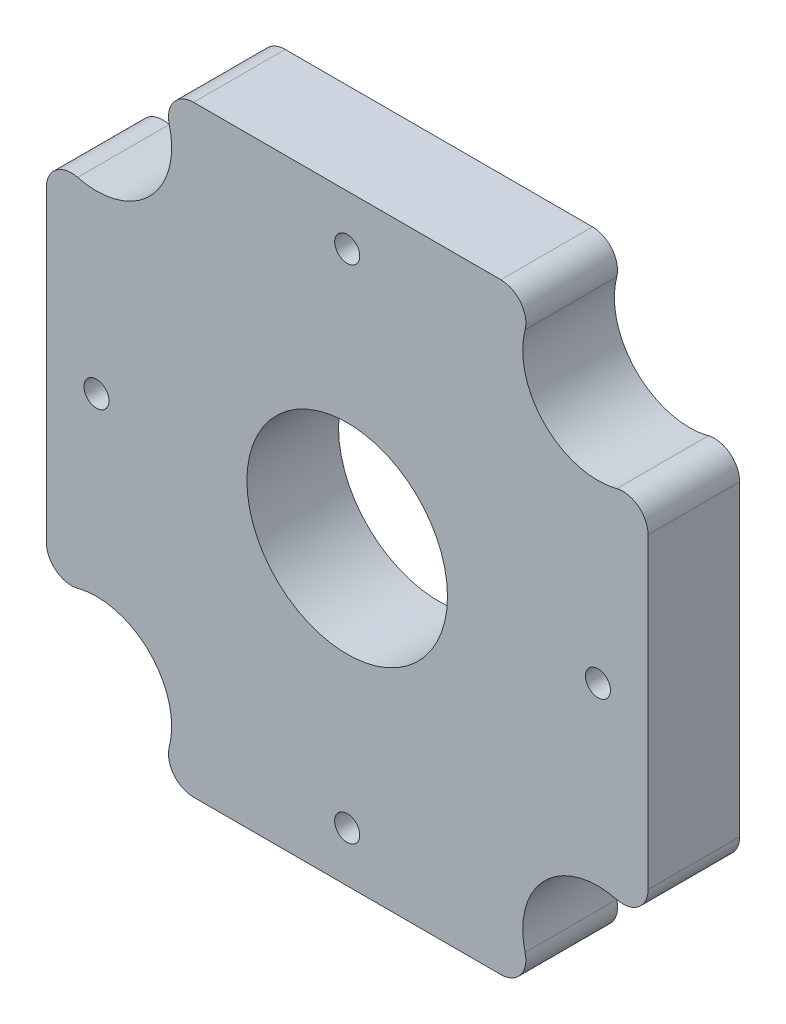
ISO-10303-21;
HEADER;
FILE_DESCRIPTION(('STEP AP214'),'2;1');
FILE_NAME('part.step','',(''),(''),'','','');
FILE_SCHEMA(('AUTOMOTIVE_DESIGN { 1 0 10303 214 1 1 1 1 }'));
ENDSEC;
DATA;
#1=APPLICATION_CONTEXT('core data for automotive mechanical design processes');
#2=APPLICATION_PROTOCOL_DEFINITION('international standard','automotive_design',2000,#1);
#3=PRODUCT_CONTEXT('',#1,'mechanical');
#4=PRODUCT('Part','Part','',(#3));
#5=PRODUCT_RELATED_PRODUCT_CATEGORY('part','',(#4));
#6=PRODUCT_DEFINITION_FORMATION('','',#4);
#7=PRODUCT_DEFINITION_CONTEXT('part definition',#1,'design');
#8=PRODUCT_DEFINITION('design','',#6,#7);
#9=PRODUCT_DEFINITION_SHAPE('','',#8);
#10=(LENGTH_UNIT() NAMED_UNIT(*) SI_UNIT(.MILLI.,.METRE.));
#11=(NAMED_UNIT(*) PLANE_ANGLE_UNIT() SI_UNIT($,.RADIAN.));
#12=(NAMED_UNIT(*) SI_UNIT($,.STERADIAN.) SOLID_ANGLE_UNIT());
#13=UNCERTAINTY_MEASURE_WITH_UNIT(LENGTH_MEASURE(1.E-05),#10,'distance_accuracy_value','');
#14=(GEOMETRIC_REPRESENTATION_CONTEXT(3) GLOBAL_UNCERTAINTY_ASSIGNED_CONTEXT((#13)) GLOBAL_UNIT_ASSIGNED_CONTEXT((#10,
#11,#12)) REPRESENTATION_CONTEXT('',''));
#15=CARTESIAN_POINT('',(0.,0.,0.));
#16=DIRECTION('',(0.,0.,1.));
#17=DIRECTION('',(1.,0.,0.));
#18=AXIS2_PLACEMENT_3D('',#15,#16,#17);
#19=CARTESIAN_POINT('',(-15.875,15.875,5.8));
#20=DIRECTION('',(0.,0.,-1.));
#21=DIRECTION('',(-1.,0.,0.));
#22=AXIS2_PLACEMENT_3D('',#19,#20,#21);
#23=CYLINDRICAL_SURFACE('',#22,4.7625);
#24=CARTESIAN_POINT('',(-15.875,15.875,5.8));
#25=DIRECTION('',(0.,0.,-1.));
#26=DIRECTION('',(-1.,0.,0.));
#27=AXIS2_PLACEMENT_3D('',#24,#25,#26);
#28=CIRCLE('',#27,4.7625);
#29=CARTESIAN_POINT('',(-11.2637292034218,17.065625,5.8));
#30=VERTEX_POINT('',#29);
#31=CARTESIAN_POINT('',(-17.065625,11.2637292034218,5.8));
#32=VERTEX_POINT('',#31);
#33=EDGE_CURVE('E185',#30,#32,#28,.T.);
#34=ORIENTED_EDGE('',*,*,#33,.F.);
#35=DIRECTION('',(0.,0.,-1.));
#36=VECTOR('',#35,1.);
#37=CARTESIAN_POINT('',(-11.2637292034218,17.065625,5.8));
#38=LINE('',#37,#36);
#39=CARTESIAN_POINT('',(-11.2637292034218,17.065625,0.));
#40=VERTEX_POINT('',#39);
#41=EDGE_CURVE('E11',#30,#40,#38,.T.);
#42=ORIENTED_EDGE('',*,*,#41,.T.);
#43=CARTESIAN_POINT('',(-15.875,15.875,0.));
#44=DIRECTION('',(0.,0.,-1.));
#45=DIRECTION('',(-1.,0.,0.));
#46=AXIS2_PLACEMENT_3D('',#43,#44,#45);
#47=CIRCLE('',#46,4.7625);
#48=CARTESIAN_POINT('',(-17.065625,11.2637292034218,0.));
#49=VERTEX_POINT('',#48);
#50=EDGE_CURVE('E252',#40,#49,#47,.T.);
#51=ORIENTED_EDGE('',*,*,#50,.T.);
#52=DIRECTION('',(0.,0.,-1.));
#53=VECTOR('',#52,1.);
#54=CARTESIAN_POINT('',(-17.065625,11.2637292034218,5.8));
#55=LINE('',#54,#53);
#56=EDGE_CURVE('E40',#49,#32,#55,.F.);
#57=ORIENTED_EDGE('',*,*,#56,.T.);
#58=EDGE_LOOP('',(#34,#42,#51,#57));
#59=FACE_BOUND('',#58,.T.);
#60=ADVANCED_FACE('F32',(#59),#23,.F.);
#61=CARTESIAN_POINT('',(-19.05,12.3252420857191,5.8));
#62=DIRECTION('',(1.,0.,0.));
#63=DIRECTION('',(0.,0.,-1.));
#64=AXIS2_PLACEMENT_3D('',#61,#62,#63);
#65=PLANE('',#64);
#66=DIRECTION('',(0.,-1.,0.));
#67=VECTOR('',#66,1.);
#68=CARTESIAN_POINT('',(-19.05,12.3252420857191,0.));
#69=LINE('',#68,#67);
#70=CARTESIAN_POINT('',(-19.05,9.72663893789572,0.));
#71=VERTEX_POINT('',#70);
#72=CARTESIAN_POINT('',(-19.05,-9.72663893789572,0.));
#73=VERTEX_POINT('',#72);
#74=EDGE_CURVE('E267',#71,#73,#69,.T.);
#75=ORIENTED_EDGE('',*,*,#74,.T.);
#76=DIRECTION('',(0.,0.,-1.));
#77=VECTOR('',#76,1.);
#78=CARTESIAN_POINT('',(-19.05,-9.72663893789572,5.8));
#79=LINE('',#78,#77);
#80=CARTESIAN_POINT('',(-19.05,-9.72663893789572,5.8));
#81=VERTEX_POINT('',#80);
#82=EDGE_CURVE('E230',#73,#81,#79,.F.);
#83=ORIENTED_EDGE('',*,*,#82,.T.);
#84=DIRECTION('',(0.,-1.,0.));
#85=VECTOR('',#84,1.);
#86=CARTESIAN_POINT('',(-19.05,12.3252420857191,5.8));
#87=LINE('',#86,#85);
#88=CARTESIAN_POINT('',(-19.05,9.72663893789572,5.8));
#89=VERTEX_POINT('',#88);
#90=EDGE_CURVE('E260',#89,#81,#87,.T.);
#91=ORIENTED_EDGE('',*,*,#90,.F.);
#92=DIRECTION('',(0.,0.,-1.));
#93=VECTOR('',#92,1.);
#94=CARTESIAN_POINT('',(-19.05,9.72663893789572,5.8));
#95=LINE('',#94,#93);
#96=EDGE_CURVE('E227',#89,#71,#95,.T.);
#97=ORIENTED_EDGE('',*,*,#96,.T.);
#98=EDGE_LOOP('',(#75,#83,#91,#97));
#99=FACE_BOUND('',#98,.T.);
#100=ADVANCED_FACE('F266',(#99),#65,.F.);
#101=CARTESIAN_POINT('',(-15.875,-15.875,5.8));
#102=DIRECTION('',(0.,0.,-1.));
#103=DIRECTION('',(-1.,0.,0.));
#104=AXIS2_PLACEMENT_3D('',#101,#102,#103);
#105=CYLINDRICAL_SURFACE('',#104,4.7625);
#106=CARTESIAN_POINT('',(-15.875,-15.875,5.8));
#107=DIRECTION('',(0.,0.,-1.));
#108=DIRECTION('',(1.,0.,0.));
#109=AXIS2_PLACEMENT_3D('',#106,#107,#108);
#110=CIRCLE('',#109,4.7625);
#111=CARTESIAN_POINT('',(-17.065625,-11.2637292034218,5.8));
#112=VERTEX_POINT('',#111);
#113=CARTESIAN_POINT('',(-11.2637292034218,-17.065625,5.8));
#114=VERTEX_POINT('',#113);
#115=EDGE_CURVE('E297',#112,#114,#110,.T.);
#116=ORIENTED_EDGE('',*,*,#115,.F.);
#117=DIRECTION('',(0.,0.,-1.));
#118=VECTOR('',#117,1.);
#119=CARTESIAN_POINT('',(-17.065625,-11.2637292034218,5.8));
#120=LINE('',#119,#118);
#121=CARTESIAN_POINT('',(-17.065625,-11.2637292034218,0.));
#122=VERTEX_POINT('',#121);
#123=EDGE_CURVE('E224',#112,#122,#120,.T.);
#124=ORIENTED_EDGE('',*,*,#123,.T.);
#125=CARTESIAN_POINT('',(-15.875,-15.875,0.));
#126=DIRECTION('',(0.,0.,-1.));
#127=DIRECTION('',(1.,0.,0.));
#128=AXIS2_PLACEMENT_3D('',#125,#126,#127);
#129=CIRCLE('',#128,4.7625);
#130=CARTESIAN_POINT('',(-11.2637292034218,-17.065625,0.));
#131=VERTEX_POINT('',#130);
#132=EDGE_CURVE('E270',#122,#131,#129,.T.);
#133=ORIENTED_EDGE('',*,*,#132,.T.);
#134=DIRECTION('',(0.,0.,-1.));
#135=VECTOR('',#134,1.);
#136=CARTESIAN_POINT('',(-11.2637292034218,-17.065625,5.8));
#137=LINE('',#136,#135);
#138=EDGE_CURVE('E222',#131,#114,#137,.F.);
#139=ORIENTED_EDGE('',*,*,#138,.T.);
#140=EDGE_LOOP('',(#116,#124,#133,#139));
#141=FACE_BOUND('',#140,.T.);
#142=ADVANCED_FACE('F330',(#141),#105,.F.);
#143=CARTESIAN_POINT('',(12.3252420857191,-19.05,5.8));
#144=DIRECTION('',(0.,1.,0.));
#145=DIRECTION('',(0.,0.,1.));
#146=AXIS2_PLACEMENT_3D('',#143,#144,#145);
#147=PLANE('',#146);
#148=DIRECTION('',(1.,0.,0.));
#149=VECTOR('',#148,1.);
#150=CARTESIAN_POINT('',(12.3252420857191,-19.05,5.8));
#151=LINE('',#150,#149);
#152=CARTESIAN_POINT('',(-9.72663893789572,-19.05,5.8));
#153=VERTEX_POINT('',#152);
#154=CARTESIAN_POINT('',(9.7266389378957,-19.05,5.8));
#155=VERTEX_POINT('',#154);
#156=EDGE_CURVE('E291',#153,#155,#151,.T.);
#157=ORIENTED_EDGE('',*,*,#156,.F.);
#158=DIRECTION('',(0.,0.,-1.));
#159=VECTOR('',#158,1.);
#160=CARTESIAN_POINT('',(-9.72663893789572,-19.05,5.8));
#161=LINE('',#160,#159);
#162=CARTESIAN_POINT('',(-9.72663893789572,-19.05,0.));
#163=VERTEX_POINT('',#162);
#164=EDGE_CURVE('E234',#153,#163,#161,.T.);
#165=ORIENTED_EDGE('',*,*,#164,.T.);
#166=DIRECTION('',(1.,0.,0.));
#167=VECTOR('',#166,1.);
#168=CARTESIAN_POINT('',(12.3252420857191,-19.05,0.));
#169=LINE('',#168,#167);
#170=CARTESIAN_POINT('',(9.7266389378957,-19.05,0.));
#171=VERTEX_POINT('',#170);
#172=EDGE_CURVE('E180',#163,#171,#169,.T.);
#173=ORIENTED_EDGE('',*,*,#172,.T.);
#174=DIRECTION('',(0.,0.,-1.));
#175=VECTOR('',#174,1.);
#176=CARTESIAN_POINT('',(9.7266389378957,-19.05,5.8));
#177=LINE('',#176,#175);
#178=EDGE_CURVE('E232',#171,#155,#177,.F.);
#179=ORIENTED_EDGE('',*,*,#178,.T.);
#180=EDGE_LOOP('',(#157,#165,#173,#179));
#181=FACE_BOUND('',#180,.T.);
#182=ADVANCED_FACE('F282',(#181),#147,.F.);
#183=CARTESIAN_POINT('',(15.875,-15.875,5.8));
#184=DIRECTION('',(0.,0.,-1.));
#185=DIRECTION('',(-1.,0.,0.));
#186=AXIS2_PLACEMENT_3D('',#183,#184,#185);
#187=CYLINDRICAL_SURFACE('',#186,4.7625);
#188=CARTESIAN_POINT('',(15.875,-15.875,0.));
#189=DIRECTION('',(0.,0.,-1.));
#190=DIRECTION('',(-1.,0.,0.));
#191=AXIS2_PLACEMENT_3D('',#188,#189,#190);
#192=CIRCLE('',#191,4.7625);
#193=CARTESIAN_POINT('',(11.2637292034218,-17.065625,0.));
#194=VERTEX_POINT('',#193);
#195=CARTESIAN_POINT('',(17.065625,-11.2637292034218,0.));
#196=VERTEX_POINT('',#195);
#197=EDGE_CURVE('E175',#194,#196,#192,.T.);
#198=ORIENTED_EDGE('',*,*,#197,.T.);
#199=DIRECTION('',(0.,0.,-1.));
#200=VECTOR('',#199,1.);
#201=CARTESIAN_POINT('',(17.065625,-11.2637292034218,5.8));
#202=LINE('',#201,#200);
#203=CARTESIAN_POINT('',(17.065625,-11.2637292034218,5.8));
#204=VERTEX_POINT('',#203);
#205=EDGE_CURVE('E152',#196,#204,#202,.F.);
#206=ORIENTED_EDGE('',*,*,#205,.T.);
#207=CARTESIAN_POINT('',(15.875,-15.875,5.8));
#208=DIRECTION('',(0.,0.,-1.));
#209=DIRECTION('',(-1.,0.,0.));
#210=AXIS2_PLACEMENT_3D('',#207,#208,#209);
#211=CIRCLE('',#210,4.7625);
#212=CARTESIAN_POINT('',(11.2637292034218,-17.065625,5.8));
#213=VERTEX_POINT('',#212);
#214=EDGE_CURVE('E290',#213,#204,#211,.T.);
#215=ORIENTED_EDGE('',*,*,#214,.F.);
#216=DIRECTION('',(0.,0.,-1.));
#217=VECTOR('',#216,1.);
#218=CARTESIAN_POINT('',(11.2637292034218,-17.065625,5.8));
#219=LINE('',#218,#217);
#220=EDGE_CURVE('E157',#213,#194,#219,.T.);
#221=ORIENTED_EDGE('',*,*,#220,.T.);
#222=EDGE_LOOP('',(#198,#206,#215,#221));
#223=FACE_BOUND('',#222,.T.);
#224=ADVANCED_FACE('F293',(#223),#187,.F.);
#225=CARTESIAN_POINT('',(19.05,12.3252420857191,5.8));
#226=DIRECTION('',(-1.,0.,0.));
#227=DIRECTION('',(0.,0.,1.));
#228=AXIS2_PLACEMENT_3D('',#225,#226,#227);
#229=PLANE('',#228);
#230=DIRECTION('',(0.,1.,0.));
#231=VECTOR('',#230,1.);
#232=CARTESIAN_POINT('',(19.05,12.3252420857191,5.8));
#233=LINE('',#232,#231);
#234=CARTESIAN_POINT('',(19.05,-9.72663893789571,5.8));
#235=VERTEX_POINT('',#234);
#236=CARTESIAN_POINT('',(19.05,9.72663893789571,5.8));
#237=VERTEX_POINT('',#236);
#238=EDGE_CURVE('E167',#235,#237,#233,.T.);
#239=ORIENTED_EDGE('',*,*,#238,.F.);
#240=DIRECTION('',(0.,0.,-1.));
#241=VECTOR('',#240,1.);
#242=CARTESIAN_POINT('',(19.05,-9.72663893789571,5.8));
#243=LINE('',#242,#241);
#244=CARTESIAN_POINT('',(19.05,-9.72663893789571,0.));
#245=VERTEX_POINT('',#244);
#246=EDGE_CURVE('E151',#235,#245,#243,.T.);
#247=ORIENTED_EDGE('',*,*,#246,.T.);
#248=DIRECTION('',(0.,1.,0.));
#249=VECTOR('',#248,1.);
#250=CARTESIAN_POINT('',(19.05,12.3252420857191,0.));
#251=LINE('',#250,#249);
#252=CARTESIAN_POINT('',(19.05,9.72663893789571,0.));
#253=VERTEX_POINT('',#252);
#254=EDGE_CURVE('E164',#245,#253,#251,.T.);
#255=ORIENTED_EDGE('',*,*,#254,.T.);
#256=DIRECTION('',(0.,0.,-1.));
#257=VECTOR('',#256,1.);
#258=CARTESIAN_POINT('',(19.05,9.72663893789571,5.8));
#259=LINE('',#258,#257);
#260=EDGE_CURVE('E169',#253,#237,#259,.F.);
#261=ORIENTED_EDGE('',*,*,#260,.T.);
#262=EDGE_LOOP('',(#239,#247,#255,#261));
#263=FACE_BOUND('',#262,.T.);
#264=ADVANCED_FACE('F163',(#263),#229,.F.);
#265=CARTESIAN_POINT('',(15.875,15.875,5.8));
#266=DIRECTION('',(0.,0.,-1.));
#267=DIRECTION('',(-1.,0.,0.));
#268=AXIS2_PLACEMENT_3D('',#265,#266,#267);
#269=CYLINDRICAL_SURFACE('',#268,4.7625);
#270=CARTESIAN_POINT('',(15.875,15.875,5.8));
#271=DIRECTION('',(0.,0.,-1.));
#272=DIRECTION('',(1.,0.,0.));
#273=AXIS2_PLACEMENT_3D('',#270,#271,#272);
#274=CIRCLE('',#273,4.7625);
#275=CARTESIAN_POINT('',(17.065625,11.2637292034218,5.8));
#276=VERTEX_POINT('',#275);
#277=CARTESIAN_POINT('',(11.2637292034218,17.065625,5.8));
#278=VERTEX_POINT('',#277);
#279=EDGE_CURVE('E295',#276,#278,#274,.T.);
#280=ORIENTED_EDGE('',*,*,#279,.F.);
#281=DIRECTION('',(0.,0.,-1.));
#282=VECTOR('',#281,1.);
#283=CARTESIAN_POINT('',(17.065625,11.2637292034218,5.8));
#284=LINE('',#283,#282);
#285=CARTESIAN_POINT('',(17.065625,11.2637292034218,0.));
#286=VERTEX_POINT('',#285);
#287=EDGE_CURVE('E239',#276,#286,#284,.T.);
#288=ORIENTED_EDGE('',*,*,#287,.T.);
#289=CARTESIAN_POINT('',(15.875,15.875,0.));
#290=DIRECTION('',(0.,0.,-1.));
#291=DIRECTION('',(1.,0.,0.));
#292=AXIS2_PLACEMENT_3D('',#289,#290,#291);
#293=CIRCLE('',#292,4.7625);
#294=CARTESIAN_POINT('',(11.2637292034218,17.065625,0.));
#295=VERTEX_POINT('',#294);
#296=EDGE_CURVE('E174',#286,#295,#293,.T.);
#297=ORIENTED_EDGE('',*,*,#296,.T.);
#298=DIRECTION('',(0.,0.,-1.));
#299=VECTOR('',#298,1.);
#300=CARTESIAN_POINT('',(11.2637292034218,17.065625,5.8));
#301=LINE('',#300,#299);
#302=EDGE_CURVE('E237',#295,#278,#301,.F.);
#303=ORIENTED_EDGE('',*,*,#302,.T.);
#304=EDGE_LOOP('',(#280,#288,#297,#303));
#305=FACE_BOUND('',#304,.T.);
#306=ADVANCED_FACE('F311',(#305),#269,.F.);
#307=CARTESIAN_POINT('',(12.3252420857191,19.05,5.8));
#308=DIRECTION('',(0.,-1.,0.));
#309=DIRECTION('',(0.,0.,-1.));
#310=AXIS2_PLACEMENT_3D('',#307,#308,#309);
#311=PLANE('',#310);
#312=DIRECTION('',(-1.,0.,0.));
#313=VECTOR('',#312,1.);
#314=CARTESIAN_POINT('',(12.3252420857191,19.05,5.8));
#315=LINE('',#314,#313);
#316=CARTESIAN_POINT('',(9.72663893789572,19.05,5.8));
#317=VERTEX_POINT('',#316);
#318=CARTESIAN_POINT('',(-9.72663893789572,19.05,5.8));
#319=VERTEX_POINT('',#318);
#320=EDGE_CURVE('E191',#317,#319,#315,.T.);
#321=ORIENTED_EDGE('',*,*,#320,.F.);
#322=DIRECTION('',(0.,0.,-1.));
#323=VECTOR('',#322,1.);
#324=CARTESIAN_POINT('',(9.72663893789572,19.05,5.8));
#325=LINE('',#324,#323);
#326=CARTESIAN_POINT('',(9.72663893789572,19.05,0.));
#327=VERTEX_POINT('',#326);
#328=EDGE_CURVE('E243',#317,#327,#325,.T.);
#329=ORIENTED_EDGE('',*,*,#328,.T.);
#330=DIRECTION('',(-1.,0.,0.));
#331=VECTOR('',#330,1.);
#332=CARTESIAN_POINT('',(12.3252420857191,19.05,0.));
#333=LINE('',#332,#331);
#334=CARTESIAN_POINT('',(-9.72663893789572,19.05,0.));
#335=VERTEX_POINT('',#334);
#336=EDGE_CURVE('E178',#327,#335,#333,.T.);
#337=ORIENTED_EDGE('',*,*,#336,.T.);
#338=DIRECTION('',(0.,0.,-1.));
#339=VECTOR('',#338,1.);
#340=CARTESIAN_POINT('',(-9.72663893789572,19.05,5.8));
#341=LINE('',#340,#339);
#342=EDGE_CURVE('E47',#335,#319,#341,.F.);
#343=ORIENTED_EDGE('',*,*,#342,.T.);
#344=EDGE_LOOP('',(#321,#329,#337,#343));
#345=FACE_BOUND('',#344,.T.);
#346=ADVANCED_FACE('F305',(#345),#311,.F.);
#347=CARTESIAN_POINT('',(-15.875,15.875,5.8));
#348=DIRECTION('',(0.,0.,-1.));
#349=DIRECTION('',(-1.,0.,0.));
#350=AXIS2_PLACEMENT_3D('',#347,#348,#349);
#351=PLANE('',#350);
#352=CARTESIAN_POINT('',(0.,0.,5.8));
#353=DIRECTION('',(0.,0.,1.));
#354=DIRECTION('',(1.,0.,0.));
#355=AXIS2_PLACEMENT_3D('',#352,#353,#354);
#356=CIRCLE('',#355,6.35);
#357=CARTESIAN_POINT('',(6.35,0.,5.8));
#358=VERTEX_POINT('',#357);
#359=EDGE_CURVE('E190',#358,#358,#356,.T.);
#360=ORIENTED_EDGE('',*,*,#359,.F.);
#361=EDGE_LOOP('',(#360));
#362=FACE_BOUND('',#361,.T.);
#363=CARTESIAN_POINT('',(-15.8749999999998,-2.21709065016539E-13,5.8));
#364=DIRECTION('',(0.,0.,1.));
#365=DIRECTION('',(1.,0.,0.));
#366=AXIS2_PLACEMENT_3D('',#363,#364,#365);
#367=CIRCLE('',#366,0.793749999999999);
#368=CARTESIAN_POINT('',(-15.0812499999998,-2.21709065016539E-13,5.8));
#369=VERTEX_POINT('',#368);
#370=EDGE_CURVE('E189',#369,#369,#367,.T.);
#371=ORIENTED_EDGE('',*,*,#370,.F.);
#372=EDGE_LOOP('',(#371));
#373=FACE_BOUND('',#372,.T.);
#374=CARTESIAN_POINT('',(4.4730638362037E-13,-15.875,5.8));
#375=DIRECTION('',(0.,0.,1.));
#376=DIRECTION('',(1.,0.,0.));
#377=AXIS2_PLACEMENT_3D('',#374,#375,#376);
#378=CIRCLE('',#377,0.79375);
#379=CARTESIAN_POINT('',(0.793750000000447,-15.875,5.8));
#380=VERTEX_POINT('',#379);
#381=EDGE_CURVE('E366',#380,#380,#378,.T.);
#382=ORIENTED_EDGE('',*,*,#381,.F.);
#383=EDGE_LOOP('',(#382));
#384=FACE_BOUND('',#383,.T.);
#385=CARTESIAN_POINT('',(15.875,0.,5.8));
#386=DIRECTION('',(0.,0.,1.));
#387=DIRECTION('',(1.,0.,0.));
#388=AXIS2_PLACEMENT_3D('',#385,#386,#387);
#389=CIRCLE('',#388,0.793749999999999);
#390=CARTESIAN_POINT('',(16.66875,0.,5.8));
#391=VERTEX_POINT('',#390);
#392=EDGE_CURVE('E360',#391,#391,#389,.T.);
#393=ORIENTED_EDGE('',*,*,#392,.F.);
#394=EDGE_LOOP('',(#393));
#395=FACE_BOUND('',#394,.T.);
#396=CARTESIAN_POINT('',(0.,15.875,5.8));
#397=DIRECTION('',(0.,0.,1.));
#398=DIRECTION('',(1.,0.,0.));
#399=AXIS2_PLACEMENT_3D('',#396,#397,#398);
#400=CIRCLE('',#399,0.79375);
#401=CARTESIAN_POINT('',(0.79375,15.875,5.8));
#402=VERTEX_POINT('',#401);
#403=EDGE_CURVE('E354',#402,#402,#400,.T.);
#404=ORIENTED_EDGE('',*,*,#403,.F.);
#405=EDGE_LOOP('',(#404));
#406=FACE_BOUND('',#405,.T.);
#407=ORIENTED_EDGE('',*,*,#214,.T.);
#408=CARTESIAN_POINT('',(17.4625,-9.72663893789571,5.8));
#409=DIRECTION('',(0.,0.,-1.));
#410=DIRECTION('',(-1.,0.,0.));
#411=AXIS2_PLACEMENT_3D('',#408,#409,#410);
#412=CIRCLE('',#411,1.5875);
#413=EDGE_CURVE('E220',#204,#235,#412,.F.);
#414=ORIENTED_EDGE('',*,*,#413,.T.);
#415=ORIENTED_EDGE('',*,*,#238,.T.);
#416=CARTESIAN_POINT('',(17.4625,9.72663893789571,5.8));
#417=DIRECTION('',(0.,0.,-1.));
#418=DIRECTION('',(-1.,0.,0.));
#419=AXIS2_PLACEMENT_3D('',#416,#417,#418);
#420=CIRCLE('',#419,1.5875);
#421=EDGE_CURVE('E212',#237,#276,#420,.F.);
#422=ORIENTED_EDGE('',*,*,#421,.T.);
#423=ORIENTED_EDGE('',*,*,#279,.T.);
#424=CARTESIAN_POINT('',(9.72663893789572,17.4625,5.8));
#425=DIRECTION('',(0.,0.,-1.));
#426=DIRECTION('',(-1.,0.,0.));
#427=AXIS2_PLACEMENT_3D('',#424,#425,#426);
#428=CIRCLE('',#427,1.5875);
#429=EDGE_CURVE('E54',#278,#317,#428,.F.);
#430=ORIENTED_EDGE('',*,*,#429,.T.);
#431=ORIENTED_EDGE('',*,*,#320,.T.);
#432=CARTESIAN_POINT('',(-9.72663893789572,17.4625,5.8));
#433=DIRECTION('',(0.,0.,-1.));
#434=DIRECTION('',(-1.,0.,0.));
#435=AXIS2_PLACEMENT_3D('',#432,#433,#434);
#436=CIRCLE('',#435,1.5875);
#437=EDGE_CURVE('E209',#319,#30,#436,.F.);
#438=ORIENTED_EDGE('',*,*,#437,.T.);
#439=ORIENTED_EDGE('',*,*,#33,.T.);
#440=CARTESIAN_POINT('',(-17.4625,9.72663893789572,5.8));
#441=DIRECTION('',(0.,0.,-1.));
#442=DIRECTION('',(-1.,0.,0.));
#443=AXIS2_PLACEMENT_3D('',#440,#441,#442);
#444=CIRCLE('',#443,1.5875);
#445=EDGE_CURVE('E207',#32,#89,#444,.F.);
#446=ORIENTED_EDGE('',*,*,#445,.T.);
#447=ORIENTED_EDGE('',*,*,#90,.T.);
#448=CARTESIAN_POINT('',(-17.4625,-9.72663893789572,5.8));
#449=DIRECTION('',(0.,0.,-1.));
#450=DIRECTION('',(-1.,0.,0.));
#451=AXIS2_PLACEMENT_3D('',#448,#449,#450);
#452=CIRCLE('',#451,1.5875);
#453=EDGE_CURVE('E218',#81,#112,#452,.F.);
#454=ORIENTED_EDGE('',*,*,#453,.T.);
#455=ORIENTED_EDGE('',*,*,#115,.T.);
#456=CARTESIAN_POINT('',(-9.72663893789572,-17.4625,5.8));
#457=DIRECTION('',(0.,0.,-1.));
#458=DIRECTION('',(-1.,0.,0.));
#459=AXIS2_PLACEMENT_3D('',#456,#457,#458);
#460=CIRCLE('',#459,1.5875);
#461=EDGE_CURVE('E216',#114,#153,#460,.F.);
#462=ORIENTED_EDGE('',*,*,#461,.T.);
#463=ORIENTED_EDGE('',*,*,#156,.T.);
#464=CARTESIAN_POINT('',(9.7266389378957,-17.4625,5.8));
#465=DIRECTION('',(0.,0.,-1.));
#466=DIRECTION('',(-1.,0.,0.));
#467=AXIS2_PLACEMENT_3D('',#464,#465,#466);
#468=CIRCLE('',#467,1.5875);
#469=EDGE_CURVE('E214',#155,#213,#468,.F.);
#470=ORIENTED_EDGE('',*,*,#469,.T.);
#471=EDGE_LOOP('',(#407,#414,#415,#422,#423,#430,#431,#438,#439,#446,#447,#454,#455,#462,#463,#470));
#472=FACE_BOUND('',#471,.T.);
#473=ADVANCED_FACE('F256',(#362,#373,#384,#395,#406,#472),#351,.F.);
#474=CARTESIAN_POINT('',(-15.875,15.875,0.));
#475=DIRECTION('',(0.,0.,-1.));
#476=DIRECTION('',(-1.,0.,0.));
#477=AXIS2_PLACEMENT_3D('',#474,#475,#476);
#478=PLANE('',#477);
#479=CARTESIAN_POINT('',(0.,0.,0.));
#480=DIRECTION('',(0.,0.,-1.));
#481=DIRECTION('',(-1.,0.,0.));
#482=AXIS2_PLACEMENT_3D('',#479,#480,#481);
#483=CIRCLE('',#482,6.35);
#484=CARTESIAN_POINT('',(-6.35,0.,0.));
#485=VERTEX_POINT('',#484);
#486=EDGE_CURVE('E186',#485,#485,#483,.T.);
#487=ORIENTED_EDGE('',*,*,#486,.F.);
#488=EDGE_LOOP('',(#487));
#489=FACE_BOUND('',#488,.T.);
#490=CARTESIAN_POINT('',(-15.8749999999998,-2.21709065016539E-13,0.));
#491=DIRECTION('',(0.,0.,1.));
#492=DIRECTION('',(1.,0.,0.));
#493=AXIS2_PLACEMENT_3D('',#490,#491,#492);
#494=CIRCLE('',#493,0.793749999999999);
#495=CARTESIAN_POINT('',(-15.0812499999998,-2.21709065016539E-13,0.));
#496=VERTEX_POINT('',#495);
#497=EDGE_CURVE('E369',#496,#496,#494,.T.);
#498=ORIENTED_EDGE('',*,*,#497,.T.);
#499=EDGE_LOOP('',(#498));
#500=FACE_BOUND('',#499,.T.);
#501=CARTESIAN_POINT('',(4.4730638362037E-13,-15.875,0.));
#502=DIRECTION('',(0.,0.,1.));
#503=DIRECTION('',(1.,0.,0.));
#504=AXIS2_PLACEMENT_3D('',#501,#502,#503);
#505=CIRCLE('',#504,0.79375);
#506=CARTESIAN_POINT('',(0.793750000000447,-15.875,0.));
#507=VERTEX_POINT('',#506);
#508=EDGE_CURVE('E363',#507,#507,#505,.T.);
#509=ORIENTED_EDGE('',*,*,#508,.T.);
#510=EDGE_LOOP('',(#509));
#511=FACE_BOUND('',#510,.T.);
#512=CARTESIAN_POINT('',(15.875,0.,0.));
#513=DIRECTION('',(0.,0.,1.));
#514=DIRECTION('',(1.,0.,0.));
#515=AXIS2_PLACEMENT_3D('',#512,#513,#514);
#516=CIRCLE('',#515,0.793749999999999);
#517=CARTESIAN_POINT('',(16.66875,0.,0.));
#518=VERTEX_POINT('',#517);
#519=EDGE_CURVE('E357',#518,#518,#516,.T.);
#520=ORIENTED_EDGE('',*,*,#519,.T.);
#521=EDGE_LOOP('',(#520));
#522=FACE_BOUND('',#521,.T.);
#523=CARTESIAN_POINT('',(0.,15.875,0.));
#524=DIRECTION('',(0.,0.,1.));
#525=DIRECTION('',(1.,0.,0.));
#526=AXIS2_PLACEMENT_3D('',#523,#524,#525);
#527=CIRCLE('',#526,0.79375);
#528=CARTESIAN_POINT('',(0.79375,15.875,0.));
#529=VERTEX_POINT('',#528);
#530=EDGE_CURVE('E274',#529,#529,#527,.T.);
#531=ORIENTED_EDGE('',*,*,#530,.T.);
#532=EDGE_LOOP('',(#531));
#533=FACE_BOUND('',#532,.T.);
#534=ORIENTED_EDGE('',*,*,#254,.F.);
#535=CARTESIAN_POINT('',(17.4625,-9.72663893789571,0.));
#536=DIRECTION('',(0.,0.,-1.));
#537=DIRECTION('',(-1.,0.,0.));
#538=AXIS2_PLACEMENT_3D('',#535,#536,#537);
#539=CIRCLE('',#538,1.5875);
#540=EDGE_CURVE('E147',#245,#196,#539,.T.);
#541=ORIENTED_EDGE('',*,*,#540,.T.);
#542=ORIENTED_EDGE('',*,*,#197,.F.);
#543=CARTESIAN_POINT('',(9.7266389378957,-17.4625,0.));
#544=DIRECTION('',(0.,0.,-1.));
#545=DIRECTION('',(-1.,0.,0.));
#546=AXIS2_PLACEMENT_3D('',#543,#544,#545);
#547=CIRCLE('',#546,1.5875);
#548=EDGE_CURVE('E199',#194,#171,#547,.T.);
#549=ORIENTED_EDGE('',*,*,#548,.T.);
#550=ORIENTED_EDGE('',*,*,#172,.F.);
#551=CARTESIAN_POINT('',(-9.72663893789572,-17.4625,0.));
#552=DIRECTION('',(0.,0.,-1.));
#553=DIRECTION('',(-1.,0.,0.));
#554=AXIS2_PLACEMENT_3D('',#551,#552,#553);
#555=CIRCLE('',#554,1.5875);
#556=EDGE_CURVE('E201',#163,#131,#555,.T.);
#557=ORIENTED_EDGE('',*,*,#556,.T.);
#558=ORIENTED_EDGE('',*,*,#132,.F.);
#559=CARTESIAN_POINT('',(-17.4625,-9.72663893789572,0.));
#560=DIRECTION('',(0.,0.,-1.));
#561=DIRECTION('',(-1.,0.,0.));
#562=AXIS2_PLACEMENT_3D('',#559,#560,#561);
#563=CIRCLE('',#562,1.5875);
#564=EDGE_CURVE('E158',#122,#73,#563,.T.);
#565=ORIENTED_EDGE('',*,*,#564,.T.);
#566=ORIENTED_EDGE('',*,*,#74,.F.);
#567=CARTESIAN_POINT('',(-17.4625,9.72663893789572,0.));
#568=DIRECTION('',(0.,0.,-1.));
#569=DIRECTION('',(-1.,0.,0.));
#570=AXIS2_PLACEMENT_3D('',#567,#568,#569);
#571=CIRCLE('',#570,1.5875);
#572=EDGE_CURVE('E168',#71,#49,#571,.T.);
#573=ORIENTED_EDGE('',*,*,#572,.T.);
#574=ORIENTED_EDGE('',*,*,#50,.F.);
#575=CARTESIAN_POINT('',(-9.72663893789572,17.4625,0.));
#576=DIRECTION('',(0.,0.,-1.));
#577=DIRECTION('',(-1.,0.,0.));
#578=AXIS2_PLACEMENT_3D('',#575,#576,#577);
#579=CIRCLE('',#578,1.5875);
#580=EDGE_CURVE('E194',#40,#335,#579,.T.);
#581=ORIENTED_EDGE('',*,*,#580,.T.);
#582=ORIENTED_EDGE('',*,*,#336,.F.);
#583=CARTESIAN_POINT('',(9.72663893789572,17.4625,0.));
#584=DIRECTION('',(0.,0.,-1.));
#585=DIRECTION('',(-1.,0.,0.));
#586=AXIS2_PLACEMENT_3D('',#583,#584,#585);
#587=CIRCLE('',#586,1.5875);
#588=EDGE_CURVE('E196',#327,#295,#587,.T.);
#589=ORIENTED_EDGE('',*,*,#588,.T.);
#590=ORIENTED_EDGE('',*,*,#296,.F.);
#591=CARTESIAN_POINT('',(17.4625,9.72663893789571,0.));
#592=DIRECTION('',(0.,0.,-1.));
#593=DIRECTION('',(-1.,0.,0.));
#594=AXIS2_PLACEMENT_3D('',#591,#592,#593);
#595=CIRCLE('',#594,1.5875);
#596=EDGE_CURVE('E173',#286,#253,#595,.T.);
#597=ORIENTED_EDGE('',*,*,#596,.T.);
#598=EDGE_LOOP('',(#534,#541,#542,#549,#550,#557,#558,#565,#566,#573,#574,#581,#582,#589,#590,#597));
#599=FACE_BOUND('',#598,.T.);
#600=ADVANCED_FACE('F171',(#489,#500,#511,#522,#533,#599),#478,.T.);
#601=CARTESIAN_POINT('',(0.,15.875,0.));
#602=DIRECTION('',(0.,0.,1.));
#603=DIRECTION('',(1.,0.,0.));
#604=AXIS2_PLACEMENT_3D('',#601,#602,#603);
#605=CYLINDRICAL_SURFACE('',#604,0.79375);
#606=ORIENTED_EDGE('',*,*,#530,.F.);
#607=EDGE_LOOP('',(#606));
#608=FACE_BOUND('',#607,.T.);
#609=ORIENTED_EDGE('',*,*,#403,.T.);
#610=EDGE_LOOP('',(#609));
#611=FACE_BOUND('',#610,.T.);
#612=ADVANCED_FACE('F391',(#608,#611),#605,.F.);
#613=CARTESIAN_POINT('',(15.875,0.,0.));
#614=DIRECTION('',(0.,0.,1.));
#615=DIRECTION('',(1.,0.,0.));
#616=AXIS2_PLACEMENT_3D('',#613,#614,#615);
#617=CYLINDRICAL_SURFACE('',#616,0.793749999999999);
#618=ORIENTED_EDGE('',*,*,#519,.F.);
#619=EDGE_LOOP('',(#618));
#620=FACE_BOUND('',#619,.T.);
#621=ORIENTED_EDGE('',*,*,#392,.T.);
#622=EDGE_LOOP('',(#621));
#623=FACE_BOUND('',#622,.T.);
#624=ADVANCED_FACE('F393',(#620,#623),#617,.F.);
#625=CARTESIAN_POINT('',(4.4730638362037E-13,-15.875,0.));
#626=DIRECTION('',(0.,0.,1.));
#627=DIRECTION('',(1.,0.,0.));
#628=AXIS2_PLACEMENT_3D('',#625,#626,#627);
#629=CYLINDRICAL_SURFACE('',#628,0.79375);
#630=ORIENTED_EDGE('',*,*,#508,.F.);
#631=EDGE_LOOP('',(#630));
#632=FACE_BOUND('',#631,.T.);
#633=ORIENTED_EDGE('',*,*,#381,.T.);
#634=EDGE_LOOP('',(#633));
#635=FACE_BOUND('',#634,.T.);
#636=ADVANCED_FACE('F400',(#632,#635),#629,.F.);
#637=CARTESIAN_POINT('',(-15.8749999999998,-2.21709065016539E-13,0.));
#638=DIRECTION('',(0.,0.,1.));
#639=DIRECTION('',(1.,0.,0.));
#640=AXIS2_PLACEMENT_3D('',#637,#638,#639);
#641=CYLINDRICAL_SURFACE('',#640,0.793749999999999);
#642=ORIENTED_EDGE('',*,*,#497,.F.);
#643=EDGE_LOOP('',(#642));
#644=FACE_BOUND('',#643,.T.);
#645=ORIENTED_EDGE('',*,*,#370,.T.);
#646=EDGE_LOOP('',(#645));
#647=FACE_BOUND('',#646,.T.);
#648=ADVANCED_FACE('F506',(#644,#647),#641,.F.);
#649=CARTESIAN_POINT('',(0.,0.,-6.9));
#650=DIRECTION('',(0.,0.,1.));
#651=DIRECTION('',(1.,0.,0.));
#652=AXIS2_PLACEMENT_3D('',#649,#650,#651);
#653=CYLINDRICAL_SURFACE('',#652,6.35);
#654=ORIENTED_EDGE('',*,*,#486,.T.);
#655=EDGE_LOOP('',(#654));
#656=FACE_BOUND('',#655,.T.);
#657=ORIENTED_EDGE('',*,*,#359,.T.);
#658=EDGE_LOOP('',(#657));
#659=FACE_BOUND('',#658,.T.);
#660=ADVANCED_FACE('F337',(#656,#659),#653,.F.);
#661=CARTESIAN_POINT('',(17.4625,-9.72663893789571,5.8));
#662=DIRECTION('',(0.,0.,-1.));
#663=DIRECTION('',(-1.,0.,0.));
#664=AXIS2_PLACEMENT_3D('',#661,#662,#663);
#665=CYLINDRICAL_SURFACE('',#664,1.5875);
#666=ORIENTED_EDGE('',*,*,#413,.F.);
#667=ORIENTED_EDGE('',*,*,#205,.F.);
#668=ORIENTED_EDGE('',*,*,#540,.F.);
#669=ORIENTED_EDGE('',*,*,#246,.F.);
#670=EDGE_LOOP('',(#666,#667,#668,#669));
#671=FACE_BOUND('',#670,.T.);
#672=ADVANCED_FACE('F150',(#671),#665,.T.);
#673=CARTESIAN_POINT('',(-17.4625,-9.72663893789572,5.8));
#674=DIRECTION('',(0.,0.,-1.));
#675=DIRECTION('',(-1.,0.,0.));
#676=AXIS2_PLACEMENT_3D('',#673,#674,#675);
#677=CYLINDRICAL_SURFACE('',#676,1.5875);
#678=ORIENTED_EDGE('',*,*,#453,.F.);
#679=ORIENTED_EDGE('',*,*,#82,.F.);
#680=ORIENTED_EDGE('',*,*,#564,.F.);
#681=ORIENTED_EDGE('',*,*,#123,.F.);
#682=EDGE_LOOP('',(#678,#679,#680,#681));
#683=FACE_BOUND('',#682,.T.);
#684=ADVANCED_FACE('F336',(#683),#677,.T.);
#685=CARTESIAN_POINT('',(-9.72663893789572,-17.4625,5.8));
#686=DIRECTION('',(0.,0.,-1.));
#687=DIRECTION('',(-1.,0.,0.));
#688=AXIS2_PLACEMENT_3D('',#685,#686,#687);
#689=CYLINDRICAL_SURFACE('',#688,1.5875);
#690=ORIENTED_EDGE('',*,*,#461,.F.);
#691=ORIENTED_EDGE('',*,*,#138,.F.);
#692=ORIENTED_EDGE('',*,*,#556,.F.);
#693=ORIENTED_EDGE('',*,*,#164,.F.);
#694=EDGE_LOOP('',(#690,#691,#692,#693));
#695=FACE_BOUND('',#694,.T.);
#696=ADVANCED_FACE('F323',(#695),#689,.T.);
#697=CARTESIAN_POINT('',(9.7266389378957,-17.4625,5.8));
#698=DIRECTION('',(0.,0.,-1.));
#699=DIRECTION('',(-1.,0.,0.));
#700=AXIS2_PLACEMENT_3D('',#697,#698,#699);
#701=CYLINDRICAL_SURFACE('',#700,1.5875);
#702=ORIENTED_EDGE('',*,*,#469,.F.);
#703=ORIENTED_EDGE('',*,*,#178,.F.);
#704=ORIENTED_EDGE('',*,*,#548,.F.);
#705=ORIENTED_EDGE('',*,*,#220,.F.);
#706=EDGE_LOOP('',(#702,#703,#704,#705));
#707=FACE_BOUND('',#706,.T.);
#708=ADVANCED_FACE('F287',(#707),#701,.T.);
#709=CARTESIAN_POINT('',(17.4625,9.72663893789571,5.8));
#710=DIRECTION('',(0.,0.,-1.));
#711=DIRECTION('',(-1.,0.,0.));
#712=AXIS2_PLACEMENT_3D('',#709,#710,#711);
#713=CYLINDRICAL_SURFACE('',#712,1.5875);
#714=ORIENTED_EDGE('',*,*,#421,.F.);
#715=ORIENTED_EDGE('',*,*,#260,.F.);
#716=ORIENTED_EDGE('',*,*,#596,.F.);
#717=ORIENTED_EDGE('',*,*,#287,.F.);
#718=EDGE_LOOP('',(#714,#715,#716,#717));
#719=FACE_BOUND('',#718,.T.);
#720=ADVANCED_FACE('F315',(#719),#713,.T.);
#721=CARTESIAN_POINT('',(9.72663893789572,17.4625,5.8));
#722=DIRECTION('',(0.,0.,-1.));
#723=DIRECTION('',(-1.,0.,0.));
#724=AXIS2_PLACEMENT_3D('',#721,#722,#723);
#725=CYLINDRICAL_SURFACE('',#724,1.5875);
#726=ORIENTED_EDGE('',*,*,#429,.F.);
#727=ORIENTED_EDGE('',*,*,#302,.F.);
#728=ORIENTED_EDGE('',*,*,#588,.F.);
#729=ORIENTED_EDGE('',*,*,#328,.F.);
#730=EDGE_LOOP('',(#726,#727,#728,#729));
#731=FACE_BOUND('',#730,.T.);
#732=ADVANCED_FACE('F307',(#731),#725,.T.);
#733=CARTESIAN_POINT('',(-9.72663893789572,17.4625,5.8));
#734=DIRECTION('',(0.,0.,-1.));
#735=DIRECTION('',(-1.,0.,0.));
#736=AXIS2_PLACEMENT_3D('',#733,#734,#735);
#737=CYLINDRICAL_SURFACE('',#736,1.5875);
#738=ORIENTED_EDGE('',*,*,#437,.F.);
#739=ORIENTED_EDGE('',*,*,#342,.F.);
#740=ORIENTED_EDGE('',*,*,#580,.F.);
#741=ORIENTED_EDGE('',*,*,#41,.F.);
#742=EDGE_LOOP('',(#738,#739,#740,#741));
#743=FACE_BOUND('',#742,.T.);
#744=ADVANCED_FACE('F303',(#743),#737,.T.);
#745=CARTESIAN_POINT('',(-17.4625,9.72663893789572,5.8));
#746=DIRECTION('',(0.,0.,-1.));
#747=DIRECTION('',(-1.,0.,0.));
#748=AXIS2_PLACEMENT_3D('',#745,#746,#747);
#749=CYLINDRICAL_SURFACE('',#748,1.5875);
#750=ORIENTED_EDGE('',*,*,#445,.F.);
#751=ORIENTED_EDGE('',*,*,#56,.F.);
#752=ORIENTED_EDGE('',*,*,#572,.F.);
#753=ORIENTED_EDGE('',*,*,#96,.F.);
#754=EDGE_LOOP('',(#750,#751,#752,#753));
#755=FACE_BOUND('',#754,.T.);
#756=ADVANCED_FACE('F34',(#755),#749,.T.);
#757=CLOSED_SHELL('',(#60,#100,#142,#182,#224,#264,#306,#346,#473,#600,#612,#624,#636,#648,#660,
#672,#684,#696,#708,#720,#732,#744,#756));
#758=MANIFOLD_SOLID_BREP('B2',#757);
#759=ADVANCED_BREP_SHAPE_REPRESENTATION('',(#18,#758),#14);
#760=SHAPE_DEFINITION_REPRESENTATION(#9,#759);
ENDSEC;
END-ISO-10303-21;
